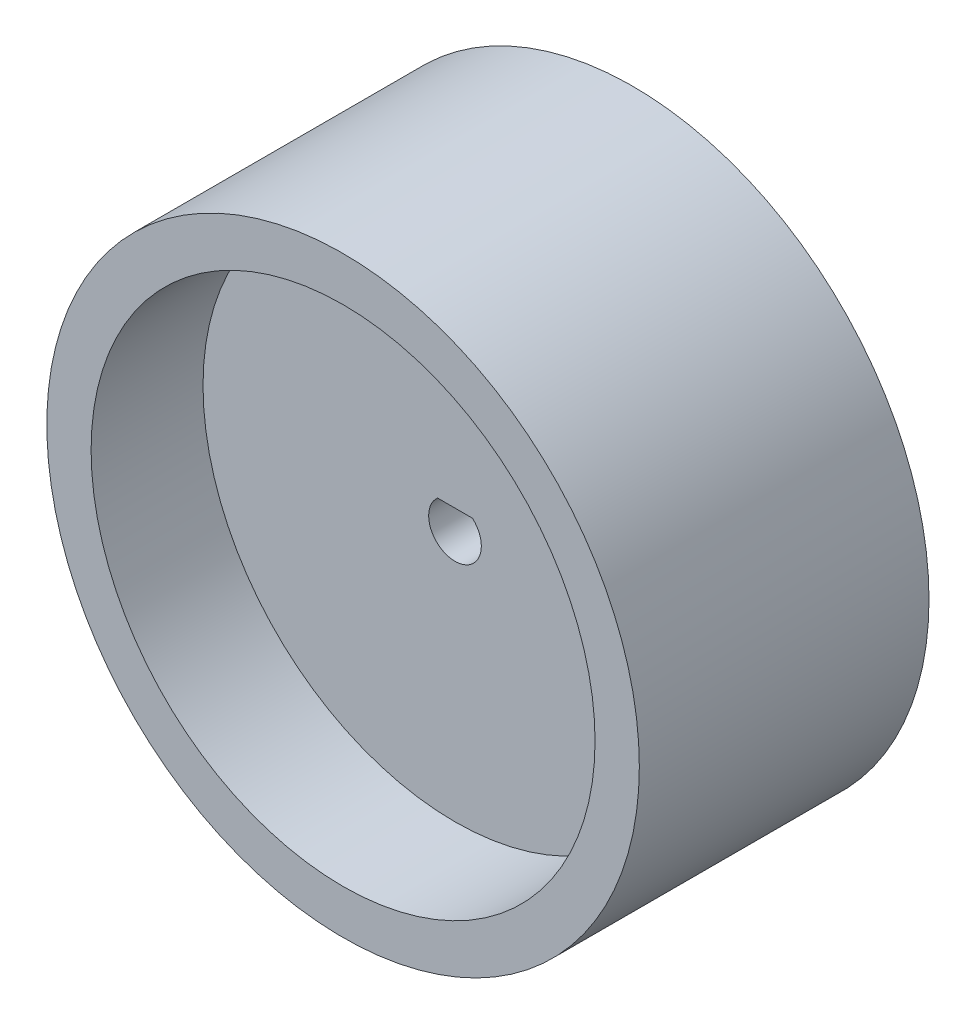
ISO-10303-21;
HEADER;
FILE_DESCRIPTION(('STEP AP214'),'2;1');
FILE_NAME('part.step','',(''),(''),'','','');
FILE_SCHEMA(('AUTOMOTIVE_DESIGN { 1 0 10303 214 1 1 1 1 }'));
ENDSEC;
DATA;
#1=APPLICATION_CONTEXT('core data for automotive mechanical design processes');
#2=APPLICATION_PROTOCOL_DEFINITION('international standard','automotive_design',2000,#1);
#3=PRODUCT_CONTEXT('',#1,'mechanical');
#4=PRODUCT('Part','Part','',(#3));
#5=PRODUCT_RELATED_PRODUCT_CATEGORY('part','',(#4));
#6=PRODUCT_DEFINITION_FORMATION('','',#4);
#7=PRODUCT_DEFINITION_CONTEXT('part definition',#1,'design');
#8=PRODUCT_DEFINITION('design','',#6,#7);
#9=PRODUCT_DEFINITION_SHAPE('','',#8);
#10=(LENGTH_UNIT() NAMED_UNIT(*) SI_UNIT(.MILLI.,.METRE.));
#11=(NAMED_UNIT(*) PLANE_ANGLE_UNIT() SI_UNIT($,.RADIAN.));
#12=(NAMED_UNIT(*) SI_UNIT($,.STERADIAN.) SOLID_ANGLE_UNIT());
#13=UNCERTAINTY_MEASURE_WITH_UNIT(LENGTH_MEASURE(1.E-05),#10,'distance_accuracy_value','');
#14=(GEOMETRIC_REPRESENTATION_CONTEXT(3) GLOBAL_UNCERTAINTY_ASSIGNED_CONTEXT((#13)) GLOBAL_UNIT_ASSIGNED_CONTEXT((#10,
#11,#12)) REPRESENTATION_CONTEXT('',''));
#15=CARTESIAN_POINT('',(0.,0.,0.));
#16=DIRECTION('',(0.,0.,1.));
#17=DIRECTION('',(1.,0.,0.));
#18=AXIS2_PLACEMENT_3D('',#15,#16,#17);
#19=CARTESIAN_POINT('',(622.689594411673,901.072344280755,1394.61701556613));
#20=DIRECTION('',(0.,0.,1.));
#21=DIRECTION('',(1.,0.,0.));
#22=AXIS2_PLACEMENT_3D('',#19,#20,#21);
#23=PLANE('',#22);
#24=DIRECTION('',(-1.,0.,0.));
#25=VECTOR('',#24,1.);
#26=CARTESIAN_POINT('',(621.366718756141,902.572344280755,1394.61701556613));
#27=LINE('',#26,#25);
#28=CARTESIAN_POINT('',(624.012470067205,902.572344280755,1394.61701556613));
#29=VERTEX_POINT('',#28);
#30=CARTESIAN_POINT('',(621.366718756141,902.572344280755,1394.61701556613));
#31=VERTEX_POINT('',#30);
#32=EDGE_CURVE('E85',#29,#31,#27,.T.);
#33=ORIENTED_EDGE('',*,*,#32,.F.);
#34=CARTESIAN_POINT('',(622.689594411673,901.072344280755,1394.61701556613));
#35=DIRECTION('',(0.,0.,1.));
#36=DIRECTION('',(1.,0.,0.));
#37=AXIS2_PLACEMENT_3D('',#34,#35,#36);
#38=CIRCLE('',#37,2.00000000000001);
#39=EDGE_CURVE('E73',#31,#29,#38,.T.);
#40=ORIENTED_EDGE('',*,*,#39,.F.);
#41=EDGE_LOOP('',(#33,#40));
#42=FACE_BOUND('',#41,.T.);
#43=CARTESIAN_POINT('',(622.689594411673,901.072344280755,1394.61701556613));
#44=DIRECTION('',(0.,0.,1.));
#45=DIRECTION('',(1.,0.,0.));
#46=AXIS2_PLACEMENT_3D('',#43,#44,#45);
#47=CIRCLE('',#46,19.1366593222624);
#48=CARTESIAN_POINT('',(641.826253733936,901.072344280755,1394.61701556613));
#49=VERTEX_POINT('',#48);
#50=EDGE_CURVE('E11',#49,#49,#47,.F.);
#51=ORIENTED_EDGE('',*,*,#50,.F.);
#52=EDGE_LOOP('',(#51));
#53=FACE_BOUND('',#52,.T.);
#54=ADVANCED_FACE('F39',(#42,#53),#23,.T.);
#55=CARTESIAN_POINT('',(622.689594411673,901.072344280755,1389.61701556613));
#56=DIRECTION('',(0.,0.,1.));
#57=DIRECTION('',(1.,0.,0.));
#58=AXIS2_PLACEMENT_3D('',#55,#56,#57);
#59=PLANE('',#58);
#60=CARTESIAN_POINT('',(622.689594411673,901.072344280755,1389.61701556613));
#61=DIRECTION('',(0.,0.,1.));
#62=DIRECTION('',(1.,0.,0.));
#63=AXIS2_PLACEMENT_3D('',#60,#61,#62);
#64=CIRCLE('',#63,5.00000000000005);
#65=CARTESIAN_POINT('',(627.689594411673,901.072344280755,1389.61701556613));
#66=VERTEX_POINT('',#65);
#67=EDGE_CURVE('E48',#66,#66,#64,.T.);
#68=ORIENTED_EDGE('',*,*,#67,.T.);
#69=EDGE_LOOP('',(#68));
#70=FACE_BOUND('',#69,.T.);
#71=CARTESIAN_POINT('',(622.689594411673,901.072344280755,1389.61701556613));
#72=DIRECTION('',(0.,0.,1.));
#73=DIRECTION('',(1.,0.,0.));
#74=AXIS2_PLACEMENT_3D('',#71,#72,#73);
#75=CIRCLE('',#74,19.1366593222624);
#76=CARTESIAN_POINT('',(641.826253733936,901.072344280755,1389.61701556613));
#77=VERTEX_POINT('',#76);
#78=EDGE_CURVE('E43',#77,#77,#75,.F.);
#79=ORIENTED_EDGE('',*,*,#78,.T.);
#80=EDGE_LOOP('',(#79));
#81=FACE_BOUND('',#80,.T.);
#82=ADVANCED_FACE('F93',(#70,#81),#59,.F.);
#83=CARTESIAN_POINT('',(622.689594411673,901.072344280755,1394.61701556613));
#84=DIRECTION('',(0.,0.,-1.));
#85=DIRECTION('',(-1.,0.,0.));
#86=AXIS2_PLACEMENT_3D('',#83,#84,#85);
#87=CYLINDRICAL_SURFACE('',#86,5.00000000000005);
#88=CARTESIAN_POINT('',(622.689594411673,901.072344280755,1381.11701556613));
#89=DIRECTION('',(0.,0.,1.));
#90=DIRECTION('',(1.,0.,0.));
#91=AXIS2_PLACEMENT_3D('',#88,#89,#90);
#92=CIRCLE('',#91,5.00000000000005);
#93=CARTESIAN_POINT('',(627.689594411673,901.072344280755,1381.11701556613));
#94=VERTEX_POINT('',#93);
#95=EDGE_CURVE('E78',#94,#94,#92,.T.);
#96=ORIENTED_EDGE('',*,*,#95,.T.);
#97=EDGE_LOOP('',(#96));
#98=FACE_BOUND('',#97,.T.);
#99=ORIENTED_EDGE('',*,*,#67,.F.);
#100=EDGE_LOOP('',(#99));
#101=FACE_BOUND('',#100,.T.);
#102=ADVANCED_FACE('F41',(#98,#101),#87,.T.);
#103=CARTESIAN_POINT('',(622.689594411673,901.072344280755,1381.11701556613));
#104=DIRECTION('',(0.,0.,1.));
#105=DIRECTION('',(1.,0.,0.));
#106=AXIS2_PLACEMENT_3D('',#103,#104,#105);
#107=PLANE('',#106);
#108=ORIENTED_EDGE('',*,*,#95,.F.);
#109=EDGE_LOOP('',(#108));
#110=FACE_BOUND('',#109,.T.);
#111=CARTESIAN_POINT('',(622.689594411673,901.072344280755,1381.11701556613));
#112=DIRECTION('',(0.,0.,1.));
#113=DIRECTION('',(1.,0.,0.));
#114=AXIS2_PLACEMENT_3D('',#111,#112,#113);
#115=CIRCLE('',#114,2.00000000000001);
#116=CARTESIAN_POINT('',(621.366718756141,902.572344280755,1381.11701556613));
#117=VERTEX_POINT('',#116);
#118=CARTESIAN_POINT('',(624.012470067205,902.572344280755,1381.11701556613));
#119=VERTEX_POINT('',#118);
#120=EDGE_CURVE('E63',#117,#119,#115,.T.);
#121=ORIENTED_EDGE('',*,*,#120,.T.);
#122=DIRECTION('',(-1.,0.,0.));
#123=VECTOR('',#122,1.);
#124=CARTESIAN_POINT('',(621.366718756141,902.572344280755,1381.11701556613));
#125=LINE('',#124,#123);
#126=EDGE_CURVE('E69',#119,#117,#125,.T.);
#127=ORIENTED_EDGE('',*,*,#126,.T.);
#128=EDGE_LOOP('',(#121,#127));
#129=FACE_BOUND('',#128,.T.);
#130=ADVANCED_FACE('F80',(#110,#129),#107,.F.);
#131=CARTESIAN_POINT('',(622.689594411673,901.072344280755,1394.61701556613));
#132=DIRECTION('',(0.,0.,-1.));
#133=DIRECTION('',(-1.,0.,0.));
#134=AXIS2_PLACEMENT_3D('',#131,#132,#133);
#135=CYLINDRICAL_SURFACE('',#134,2.00000000000001);
#136=ORIENTED_EDGE('',*,*,#120,.F.);
#137=DIRECTION('',(0.,0.,-1.));
#138=VECTOR('',#137,1.);
#139=CARTESIAN_POINT('',(621.366718756141,902.572344280755,1394.61701556613));
#140=LINE('',#139,#138);
#141=EDGE_CURVE('E71',#31,#117,#140,.T.);
#142=ORIENTED_EDGE('',*,*,#141,.F.);
#143=ORIENTED_EDGE('',*,*,#39,.T.);
#144=DIRECTION('',(0.,0.,-1.));
#145=VECTOR('',#144,1.);
#146=CARTESIAN_POINT('',(624.012470067205,902.572344280755,1394.61701556613));
#147=LINE('',#146,#145);
#148=EDGE_CURVE('E56',#29,#119,#147,.T.);
#149=ORIENTED_EDGE('',*,*,#148,.T.);
#150=EDGE_LOOP('',(#136,#142,#143,#149));
#151=FACE_BOUND('',#150,.T.);
#152=ADVANCED_FACE('F75',(#151),#135,.F.);
#153=CARTESIAN_POINT('',(621.366718756141,902.572344280755,1394.61701556613));
#154=DIRECTION('',(0.,-1.,0.));
#155=DIRECTION('',(0.,0.,-1.));
#156=AXIS2_PLACEMENT_3D('',#153,#154,#155);
#157=PLANE('',#156);
#158=ORIENTED_EDGE('',*,*,#126,.F.);
#159=ORIENTED_EDGE('',*,*,#148,.F.);
#160=ORIENTED_EDGE('',*,*,#32,.T.);
#161=ORIENTED_EDGE('',*,*,#141,.T.);
#162=EDGE_LOOP('',(#158,#159,#160,#161));
#163=FACE_BOUND('',#162,.T.);
#164=ADVANCED_FACE('F70',(#163),#157,.T.);
#165=CARTESIAN_POINT('',(622.689594411673,901.072344280755,1403.11701556613));
#166=DIRECTION('',(0.,0.,-1.));
#167=DIRECTION('',(-1.,0.,0.));
#168=AXIS2_PLACEMENT_3D('',#165,#166,#167);
#169=CYLINDRICAL_SURFACE('',#168,19.1366593222624);
#170=CARTESIAN_POINT('',(622.689594411673,901.072344280755,1381.11701556613));
#171=DIRECTION('',(0.,0.,1.));
#172=DIRECTION('',(1.,0.,0.));
#173=AXIS2_PLACEMENT_3D('',#170,#171,#172);
#174=CIRCLE('',#173,19.1366593222624);
#175=CARTESIAN_POINT('',(641.826253733936,901.072344280755,1381.11701556613));
#176=VERTEX_POINT('',#175);
#177=EDGE_CURVE('E141',#176,#176,#174,.T.);
#178=ORIENTED_EDGE('',*,*,#177,.F.);
#179=EDGE_LOOP('',(#178));
#180=FACE_BOUND('',#179,.T.);
#181=ORIENTED_EDGE('',*,*,#78,.F.);
#182=EDGE_LOOP('',(#181));
#183=FACE_BOUND('',#182,.T.);
#184=ADVANCED_FACE('F115',(#180,#183),#169,.F.);
#185=CARTESIAN_POINT('',(622.689594411673,901.072344280755,1403.11701556613));
#186=DIRECTION('',(0.,0.,1.));
#187=DIRECTION('',(1.,0.,0.));
#188=AXIS2_PLACEMENT_3D('',#185,#186,#187);
#189=PLANE('',#188);
#190=CARTESIAN_POINT('',(622.689594411673,901.072344280755,1403.11701556613));
#191=DIRECTION('',(0.,0.,1.));
#192=DIRECTION('',(1.,0.,0.));
#193=AXIS2_PLACEMENT_3D('',#190,#191,#192);
#194=CIRCLE('',#193,22.5);
#195=CARTESIAN_POINT('',(645.189594411673,901.072344280755,1403.11701556613));
#196=VERTEX_POINT('',#195);
#197=EDGE_CURVE('E83',#196,#196,#194,.T.);
#198=ORIENTED_EDGE('',*,*,#197,.T.);
#199=EDGE_LOOP('',(#198));
#200=FACE_BOUND('',#199,.T.);
#201=CARTESIAN_POINT('',(622.689594411673,901.072344280755,1403.11701556613));
#202=DIRECTION('',(0.,0.,1.));
#203=DIRECTION('',(1.,0.,0.));
#204=AXIS2_PLACEMENT_3D('',#201,#202,#203);
#205=CIRCLE('',#204,19.1366593222624);
#206=CARTESIAN_POINT('',(641.826253733936,901.072344280755,1403.11701556613));
#207=VERTEX_POINT('',#206);
#208=EDGE_CURVE('E144',#207,#207,#205,.T.);
#209=ORIENTED_EDGE('',*,*,#208,.F.);
#210=EDGE_LOOP('',(#209));
#211=FACE_BOUND('',#210,.T.);
#212=ADVANCED_FACE('F125',(#200,#211),#189,.T.);
#213=CARTESIAN_POINT('',(622.689594411673,901.072344280755,1381.11701556613));
#214=DIRECTION('',(0.,0.,1.));
#215=DIRECTION('',(1.,0.,0.));
#216=AXIS2_PLACEMENT_3D('',#213,#214,#215);
#217=PLANE('',#216);
#218=CARTESIAN_POINT('',(622.689594411673,901.072344280755,1381.11701556613));
#219=DIRECTION('',(0.,0.,1.));
#220=DIRECTION('',(1.,0.,0.));
#221=AXIS2_PLACEMENT_3D('',#218,#219,#220);
#222=CIRCLE('',#221,22.5);
#223=CARTESIAN_POINT('',(645.189594411673,901.072344280755,1381.11701556613));
#224=VERTEX_POINT('',#223);
#225=EDGE_CURVE('E147',#224,#224,#222,.T.);
#226=ORIENTED_EDGE('',*,*,#225,.F.);
#227=EDGE_LOOP('',(#226));
#228=FACE_BOUND('',#227,.T.);
#229=ORIENTED_EDGE('',*,*,#177,.T.);
#230=EDGE_LOOP('',(#229));
#231=FACE_BOUND('',#230,.T.);
#232=ADVANCED_FACE('F121',(#228,#231),#217,.F.);
#233=CARTESIAN_POINT('',(622.689594411673,901.072344280755,1403.11701556613));
#234=DIRECTION('',(0.,0.,-1.));
#235=DIRECTION('',(-1.,0.,0.));
#236=AXIS2_PLACEMENT_3D('',#233,#234,#235);
#237=CYLINDRICAL_SURFACE('',#236,22.5);
#238=ORIENTED_EDGE('',*,*,#197,.F.);
#239=EDGE_LOOP('',(#238));
#240=FACE_BOUND('',#239,.T.);
#241=ORIENTED_EDGE('',*,*,#225,.T.);
#242=EDGE_LOOP('',(#241));
#243=FACE_BOUND('',#242,.T.);
#244=ADVANCED_FACE('F117',(#240,#243),#237,.T.);
#245=ORIENTED_EDGE('',*,*,#50,.T.);
#246=EDGE_LOOP('',(#245));
#247=FACE_BOUND('',#246,.T.);
#248=ORIENTED_EDGE('',*,*,#208,.T.);
#249=EDGE_LOOP('',(#248));
#250=FACE_BOUND('',#249,.T.);
#251=ADVANCED_FACE('F120',(#247,#250),#169,.F.);
#252=CLOSED_SHELL('',(#54,#82,#102,#130,#152,#164,#184,#212,#232,#244,#251));
#253=MANIFOLD_SOLID_BREP('B2',#252);
#254=ADVANCED_BREP_SHAPE_REPRESENTATION('',(#18,#253),#14);
#255=SHAPE_DEFINITION_REPRESENTATION(#9,#254);
ENDSEC;
END-ISO-10303-21;
